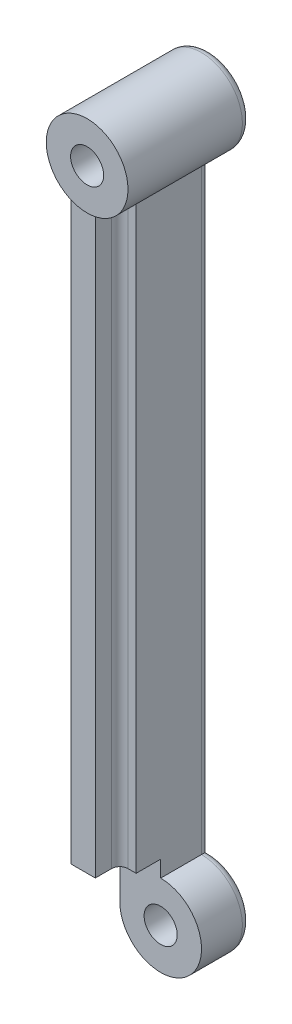
ISO-10303-21;
HEADER;
FILE_DESCRIPTION(('STEP AP214'),'2;1');
FILE_NAME('part.step','',(''),(''),'','','');
FILE_SCHEMA(('AUTOMOTIVE_DESIGN { 1 0 10303 214 1 1 1 1 }'));
ENDSEC;
DATA;
#1=APPLICATION_CONTEXT('core data for automotive mechanical design processes');
#2=APPLICATION_PROTOCOL_DEFINITION('international standard','automotive_design',2000,#1);
#3=PRODUCT_CONTEXT('',#1,'mechanical');
#4=PRODUCT('Part','Part','',(#3));
#5=PRODUCT_RELATED_PRODUCT_CATEGORY('part','',(#4));
#6=PRODUCT_DEFINITION_FORMATION('','',#4);
#7=PRODUCT_DEFINITION_CONTEXT('part definition',#1,'design');
#8=PRODUCT_DEFINITION('design','',#6,#7);
#9=PRODUCT_DEFINITION_SHAPE('','',#8);
#10=(LENGTH_UNIT() NAMED_UNIT(*) SI_UNIT(.MILLI.,.METRE.));
#11=(NAMED_UNIT(*) PLANE_ANGLE_UNIT() SI_UNIT($,.RADIAN.));
#12=(NAMED_UNIT(*) SI_UNIT($,.STERADIAN.) SOLID_ANGLE_UNIT());
#13=UNCERTAINTY_MEASURE_WITH_UNIT(LENGTH_MEASURE(1.E-05),#10,'distance_accuracy_value','');
#14=(GEOMETRIC_REPRESENTATION_CONTEXT(3) GLOBAL_UNCERTAINTY_ASSIGNED_CONTEXT((#13)) GLOBAL_UNIT_ASSIGNED_CONTEXT((#10,
#11,#12)) REPRESENTATION_CONTEXT('',''));
#15=CARTESIAN_POINT('',(0.,0.,0.));
#16=DIRECTION('',(0.,0.,1.));
#17=DIRECTION('',(1.,0.,0.));
#18=AXIS2_PLACEMENT_3D('',#15,#16,#17);
#19=CARTESIAN_POINT('',(0.,0.,9.));
#20=DIRECTION('',(0.,0.,1.));
#21=DIRECTION('',(1.,0.,0.));
#22=AXIS2_PLACEMENT_3D('',#19,#20,#21);
#23=PLANE('',#22);
#24=CARTESIAN_POINT('',(0.,85.,9.));
#25=DIRECTION('',(0.,0.,1.));
#26=DIRECTION('',(1.,0.,0.));
#27=AXIS2_PLACEMENT_3D('',#24,#25,#26);
#28=CIRCLE('',#27,5.);
#29=CARTESIAN_POINT('',(-1.,80.1010205144336,9.));
#30=VERTEX_POINT('',#29);
#31=CARTESIAN_POINT('',(0.,80.,9.));
#32=VERTEX_POINT('',#31);
#33=EDGE_CURVE('E154',#30,#32,#28,.T.);
#34=ORIENTED_EDGE('',*,*,#33,.F.);
#35=DIRECTION('',(0.,1.,0.));
#36=VECTOR('',#35,1.);
#37=CARTESIAN_POINT('',(-0.999999999999995,0.,9.));
#38=LINE('',#37,#36);
#39=CARTESIAN_POINT('',(-0.999999999999996,7.01125174005379,9.));
#40=VERTEX_POINT('',#39);
#41=EDGE_CURVE('E43',#30,#40,#38,.F.);
#42=ORIENTED_EDGE('',*,*,#41,.T.);
#43=DIRECTION('',(-1.,0.,0.));
#44=VECTOR('',#43,1.);
#45=CARTESIAN_POINT('',(0.,7.01125174005379,9.));
#46=LINE('',#45,#44);
#47=CARTESIAN_POINT('',(0.,7.01125174005379,9.));
#48=VERTEX_POINT('',#47);
#49=EDGE_CURVE('E288',#48,#40,#46,.T.);
#50=ORIENTED_EDGE('',*,*,#49,.F.);
#51=DIRECTION('',(0.,1.,0.));
#52=VECTOR('',#51,1.);
#53=CARTESIAN_POINT('',(0.,5.,9.));
#54=LINE('',#53,#52);
#55=EDGE_CURVE('E165',#48,#32,#54,.T.);
#56=ORIENTED_EDGE('',*,*,#55,.T.);
#57=EDGE_LOOP('',(#34,#42,#50,#56));
#58=FACE_BOUND('',#57,.T.);
#59=ADVANCED_FACE('F34',(#58),#23,.T.);
#60=CARTESIAN_POINT('',(0.,85.,9.));
#61=DIRECTION('',(0.,0.,-1.));
#62=DIRECTION('',(-1.,0.,0.));
#63=AXIS2_PLACEMENT_3D('',#60,#61,#62);
#64=CYLINDRICAL_SURFACE('',#63,5.00000000000001);
#65=CARTESIAN_POINT('',(0.,85.,15.));
#66=DIRECTION('',(0.,0.,1.));
#67=DIRECTION('',(1.,0.,0.));
#68=AXIS2_PLACEMENT_3D('',#65,#66,#67);
#69=CIRCLE('',#68,5.);
#70=CARTESIAN_POINT('',(5.,85.,15.));
#71=VERTEX_POINT('',#70);
#72=EDGE_CURVE('E155',#71,#71,#69,.T.);
#73=ORIENTED_EDGE('',*,*,#72,.F.);
#74=EDGE_LOOP('',(#73));
#75=FACE_BOUND('',#74,.T.);
#76=DIRECTION('',(0.,0.,-1.));
#77=VECTOR('',#76,1.);
#78=CARTESIAN_POINT('',(-2.,80.4174243050442,12.));
#79=LINE('',#78,#77);
#80=CARTESIAN_POINT('',(-2.,80.4174243050442,12.));
#81=VERTEX_POINT('',#80);
#82=CARTESIAN_POINT('',(-2.,80.4174243050442,10.));
#83=VERTEX_POINT('',#82);
#84=EDGE_CURVE('E144',#81,#83,#79,.T.);
#85=ORIENTED_EDGE('',*,*,#84,.T.);
#86=CARTESIAN_POINT('',(-2.,80.4174243050442,10.));
#87=CARTESIAN_POINT('',(-2.00000105898368,80.4174262276151,9.97330925859388));
#88=CARTESIAN_POINT('',(-1.99893067820831,80.4169574695901,9.94663228494766));
#89=CARTESIAN_POINT('',(-1.99466873623861,80.4151003556573,9.89348846480926));
#90=CARTESIAN_POINT('',(-1.99147781365518,80.4137122766078,9.86702155748223));
#91=CARTESIAN_POINT('',(-1.97879338685613,80.4082175384006,9.78841849731535));
#92=CARTESIAN_POINT('',(-1.96618777165364,80.4027799767901,9.73684034355798));
#93=CARTESIAN_POINT('',(-1.93319080474755,80.3888082858261,9.63677238261292));
#94=CARTESIAN_POINT('',(-1.91280493282475,80.3802763361181,9.58828042973909));
#95=CARTESIAN_POINT('',(-1.86495265907223,80.3607524697316,9.49543470981768));
#96=CARTESIAN_POINT('',(-1.8374811925309,80.3497587941805,9.45108393385467));
#97=CARTESIAN_POINT('',(-1.77491309193018,80.3255101435136,9.36561981488251));
#98=CARTESIAN_POINT('',(-1.73953231413985,80.3121765030245,9.32473728904799));
#99=CARTESIAN_POINT('',(-1.6628792542394,80.2844413647406,9.24934483317053));
#100=CARTESIAN_POINT('',(-1.6216046529362,80.2700394476609,9.21483742402636));
#101=CARTESIAN_POINT('',(-1.53114650537546,80.2399568916855,9.15078867626431));
#102=CARTESIAN_POINT('',(-1.48161556425956,80.2242560255882,9.12174645328768));
#103=CARTESIAN_POINT('',(-1.37820071022287,80.1933929640703,9.07250827741418));
#104=CARTESIAN_POINT('',(-1.3243191124048,80.1782304882622,9.05230765592955));
#105=CARTESIAN_POINT('',(-1.22546021527541,80.1522928665702,9.02470136000962));
#106=CARTESIAN_POINT('',(-1.18104590766897,80.1412733539145,9.01548239632729));
#107=CARTESIAN_POINT('',(-1.09114402142545,80.1202897633798,9.00312601090762));
#108=CARTESIAN_POINT('',(-1.04565657397635,80.110325557302,8.9999878496706));
#109=CARTESIAN_POINT('',(-1.00000000000001,80.1010205144336,9.));
#110=B_SPLINE_CURVE_WITH_KNOTS('',3,(#86,#87,#88,#89,#90,#91,#92,#93,#94,#95,#96,#97,#98,#99,
#100,#101,#102,#103,#104,#105,#106,#107,#108,#109),.UNSPECIFIED.,.F.,.F.,(4,2,2,2,2,2,2,2,2,2,2,
4),(0.,0.0800198389240395,0.160015590420398,0.31929780475126,0.478468040047297,
0.637752365454774,0.804101005866625,0.970515285028636,1.14827776879244,1.32594627592812,
1.46558180408251,1.60520034978918),.UNSPECIFIED.);
#111=EDGE_CURVE('E57',#83,#30,#110,.T.);
#112=ORIENTED_EDGE('',*,*,#111,.T.);
#113=ORIENTED_EDGE('',*,*,#33,.T.);
#114=DIRECTION('',(0.,0.,-1.));
#115=VECTOR('',#114,1.);
#116=CARTESIAN_POINT('',(0.,80.,9.));
#117=LINE('',#116,#115);
#118=CARTESIAN_POINT('',(0.,80.,0.999999999999999));
#119=VERTEX_POINT('',#118);
#120=EDGE_CURVE('E173',#32,#119,#117,.T.);
#121=ORIENTED_EDGE('',*,*,#120,.T.);
#122=CARTESIAN_POINT('',(0.,85.,0.999999999999999));
#123=DIRECTION('',(0.,0.,1.));
#124=DIRECTION('',(1.,0.,0.));
#125=AXIS2_PLACEMENT_3D('',#122,#123,#124);
#126=CIRCLE('',#125,5.00000000000001);
#127=CARTESIAN_POINT('',(-5.,85.,0.999999999999999));
#128=VERTEX_POINT('',#127);
#129=EDGE_CURVE('E197',#119,#128,#126,.T.);
#130=ORIENTED_EDGE('',*,*,#129,.T.);
#131=DIRECTION('',(0.,0.,-1.));
#132=VECTOR('',#131,1.);
#133=CARTESIAN_POINT('',(-5.,85.,9.));
#134=LINE('',#133,#132);
#135=CARTESIAN_POINT('',(-5.00000000000001,85.,12.));
#136=VERTEX_POINT('',#135);
#137=EDGE_CURVE('E171',#136,#128,#134,.T.);
#138=ORIENTED_EDGE('',*,*,#137,.F.);
#139=CARTESIAN_POINT('',(0.,85.,12.));
#140=DIRECTION('',(0.,0.,-1.));
#141=DIRECTION('',(1.,0.,0.));
#142=AXIS2_PLACEMENT_3D('',#139,#140,#141);
#143=CIRCLE('',#142,5.00000000000001);
#144=EDGE_CURVE('E143',#81,#136,#143,.T.);
#145=ORIENTED_EDGE('',*,*,#144,.F.);
#146=EDGE_LOOP('',(#85,#112,#113,#121,#130,#138,#145));
#147=FACE_BOUND('',#146,.T.);
#148=ADVANCED_FACE('F240',(#75,#147),#64,.T.);
#149=CARTESIAN_POINT('',(0.,0.,0.));
#150=DIRECTION('',(0.,0.,1.));
#151=DIRECTION('',(1.,0.,0.));
#152=AXIS2_PLACEMENT_3D('',#149,#150,#151);
#153=PLANE('',#152);
#154=CARTESIAN_POINT('',(0.,85.,0.));
#155=DIRECTION('',(0.,0.,1.));
#156=DIRECTION('',(1.,0.,0.));
#157=AXIS2_PLACEMENT_3D('',#154,#155,#156);
#158=CIRCLE('',#157,4.00000000000001);
#159=CARTESIAN_POINT('',(-4.,85.,0.));
#160=VERTEX_POINT('',#159);
#161=CARTESIAN_POINT('',(-1.,81.1270166537926,0.));
#162=VERTEX_POINT('',#161);
#163=EDGE_CURVE('E192',#160,#162,#158,.F.);
#164=ORIENTED_EDGE('',*,*,#163,.T.);
#165=DIRECTION('',(0.,1.,0.));
#166=VECTOR('',#165,1.);
#167=CARTESIAN_POINT('',(-1.,0.,0.));
#168=LINE('',#167,#166);
#169=CARTESIAN_POINT('',(-1.,3.87298334620742,0.));
#170=VERTEX_POINT('',#169);
#171=EDGE_CURVE('E194',#162,#170,#168,.F.);
#172=ORIENTED_EDGE('',*,*,#171,.T.);
#173=CARTESIAN_POINT('',(0.,0.,0.));
#174=DIRECTION('',(0.,0.,1.));
#175=DIRECTION('',(1.,0.,0.));
#176=AXIS2_PLACEMENT_3D('',#173,#174,#175);
#177=CIRCLE('',#176,4.);
#178=CARTESIAN_POINT('',(-4.,0.,0.));
#179=VERTEX_POINT('',#178);
#180=EDGE_CURVE('E190',#170,#179,#177,.F.);
#181=ORIENTED_EDGE('',*,*,#180,.T.);
#182=DIRECTION('',(0.,-1.,0.));
#183=VECTOR('',#182,1.);
#184=CARTESIAN_POINT('',(-4.,0.,0.));
#185=LINE('',#184,#183);
#186=EDGE_CURVE('E188',#179,#160,#185,.F.);
#187=ORIENTED_EDGE('',*,*,#186,.T.);
#188=EDGE_LOOP('',(#164,#172,#181,#187));
#189=FACE_BOUND('',#188,.T.);
#190=CARTESIAN_POINT('',(0.,85.,0.));
#191=DIRECTION('',(0.,0.,1.));
#192=DIRECTION('',(1.,0.,0.));
#193=AXIS2_PLACEMENT_3D('',#190,#191,#192);
#194=CIRCLE('',#193,2.025);
#195=CARTESIAN_POINT('',(2.025,85.,0.));
#196=VERTEX_POINT('',#195);
#197=EDGE_CURVE('E162',#196,#196,#194,.T.);
#198=ORIENTED_EDGE('',*,*,#197,.T.);
#199=EDGE_LOOP('',(#198));
#200=FACE_BOUND('',#199,.T.);
#201=CARTESIAN_POINT('',(0.,0.,0.));
#202=DIRECTION('',(0.,0.,1.));
#203=DIRECTION('',(1.,0.,0.));
#204=AXIS2_PLACEMENT_3D('',#201,#202,#203);
#205=CIRCLE('',#204,2.025);
#206=CARTESIAN_POINT('',(2.025,0.,0.));
#207=VERTEX_POINT('',#206);
#208=EDGE_CURVE('E158',#207,#207,#205,.T.);
#209=ORIENTED_EDGE('',*,*,#208,.T.);
#210=EDGE_LOOP('',(#209));
#211=FACE_BOUND('',#210,.T.);
#212=ADVANCED_FACE('F245',(#189,#200,#211),#153,.F.);
#213=CARTESIAN_POINT('',(0.,0.,9.));
#214=DIRECTION('',(0.,0.,-1.));
#215=DIRECTION('',(-1.,0.,0.));
#216=AXIS2_PLACEMENT_3D('',#213,#214,#215);
#217=CYLINDRICAL_SURFACE('',#216,5.);
#218=DIRECTION('',(0.,0.,-1.));
#219=VECTOR('',#218,1.);
#220=CARTESIAN_POINT('',(-5.,0.,9.));
#221=LINE('',#220,#219);
#222=CARTESIAN_POINT('',(-5.,0.,6.));
#223=VERTEX_POINT('',#222);
#224=CARTESIAN_POINT('',(-5.,0.,0.999999999999999));
#225=VERTEX_POINT('',#224);
#226=EDGE_CURVE('E168',#223,#225,#221,.T.);
#227=ORIENTED_EDGE('',*,*,#226,.T.);
#228=CARTESIAN_POINT('',(0.,0.,0.999999999999999));
#229=DIRECTION('',(0.,0.,1.));
#230=DIRECTION('',(1.,0.,0.));
#231=AXIS2_PLACEMENT_3D('',#228,#229,#230);
#232=CIRCLE('',#231,5.);
#233=CARTESIAN_POINT('',(0.,5.,0.999999999999999));
#234=VERTEX_POINT('',#233);
#235=EDGE_CURVE('E199',#225,#234,#232,.T.);
#236=ORIENTED_EDGE('',*,*,#235,.T.);
#237=DIRECTION('',(0.,0.,-1.));
#238=VECTOR('',#237,1.);
#239=CARTESIAN_POINT('',(0.,5.,9.));
#240=LINE('',#239,#238);
#241=CARTESIAN_POINT('',(0.,5.,6.));
#242=VERTEX_POINT('',#241);
#243=EDGE_CURVE('E176',#242,#234,#240,.T.);
#244=ORIENTED_EDGE('',*,*,#243,.F.);
#245=CARTESIAN_POINT('',(0.,0.,6.));
#246=DIRECTION('',(0.,0.,-1.));
#247=DIRECTION('',(0.,1.,0.));
#248=AXIS2_PLACEMENT_3D('',#245,#246,#247);
#249=CIRCLE('',#248,5.);
#250=EDGE_CURVE('E294',#242,#223,#249,.T.);
#251=ORIENTED_EDGE('',*,*,#250,.T.);
#252=EDGE_LOOP('',(#227,#236,#244,#251));
#253=FACE_BOUND('',#252,.T.);
#254=ADVANCED_FACE('F254',(#253),#217,.T.);
#255=CARTESIAN_POINT('',(0.,5.,9.));
#256=DIRECTION('',(-1.,0.,0.));
#257=DIRECTION('',(0.,0.,1.));
#258=AXIS2_PLACEMENT_3D('',#255,#256,#257);
#259=PLANE('',#258);
#260=ORIENTED_EDGE('',*,*,#243,.T.);
#261=DIRECTION('',(0.,1.,0.));
#262=VECTOR('',#261,1.);
#263=CARTESIAN_POINT('',(0.,5.,0.999999999999999));
#264=LINE('',#263,#262);
#265=EDGE_CURVE('E180',#234,#119,#264,.T.);
#266=ORIENTED_EDGE('',*,*,#265,.T.);
#267=ORIENTED_EDGE('',*,*,#120,.F.);
#268=ORIENTED_EDGE('',*,*,#55,.F.);
#269=DIRECTION('',(0.,0.,-1.));
#270=VECTOR('',#269,1.);
#271=CARTESIAN_POINT('',(0.,7.01125174005379,9.));
#272=LINE('',#271,#270);
#273=CARTESIAN_POINT('',(0.,7.01125174005379,6.));
#274=VERTEX_POINT('',#273);
#275=EDGE_CURVE('E185',#48,#274,#272,.T.);
#276=ORIENTED_EDGE('',*,*,#275,.T.);
#277=DIRECTION('',(0.,-1.,0.));
#278=VECTOR('',#277,1.);
#279=CARTESIAN_POINT('',(0.,5.,6.));
#280=LINE('',#279,#278);
#281=EDGE_CURVE('E184',#274,#242,#280,.T.);
#282=ORIENTED_EDGE('',*,*,#281,.T.);
#283=EDGE_LOOP('',(#260,#266,#267,#268,#276,#282));
#284=FACE_BOUND('',#283,.T.);
#285=ADVANCED_FACE('F257',(#284),#259,.F.);
#286=CARTESIAN_POINT('',(-5.,0.,9.));
#287=DIRECTION('',(1.,0.,0.));
#288=DIRECTION('',(0.,1.,0.));
#289=AXIS2_PLACEMENT_3D('',#286,#287,#288);
#290=PLANE('',#289);
#291=ORIENTED_EDGE('',*,*,#137,.T.);
#292=DIRECTION('',(0.,-1.,0.));
#293=VECTOR('',#292,1.);
#294=CARTESIAN_POINT('',(-5.,0.,0.999999999999999));
#295=LINE('',#294,#293);
#296=EDGE_CURVE('E201',#128,#225,#295,.T.);
#297=ORIENTED_EDGE('',*,*,#296,.T.);
#298=ORIENTED_EDGE('',*,*,#226,.F.);
#299=DIRECTION('',(0.,-1.,0.));
#300=VECTOR('',#299,1.);
#301=CARTESIAN_POINT('',(-5.,7.01125174005379,6.));
#302=LINE('',#301,#300);
#303=CARTESIAN_POINT('',(-5.,7.01125174005379,6.));
#304=VERTEX_POINT('',#303);
#305=EDGE_CURVE('E129',#304,#223,#302,.T.);
#306=ORIENTED_EDGE('',*,*,#305,.F.);
#307=DIRECTION('',(0.,0.,-1.));
#308=VECTOR('',#307,1.);
#309=CARTESIAN_POINT('',(-5.,7.01125174005379,12.));
#310=LINE('',#309,#308);
#311=CARTESIAN_POINT('',(-5.,7.01125174005379,12.));
#312=VERTEX_POINT('',#311);
#313=EDGE_CURVE('E121',#312,#304,#310,.T.);
#314=ORIENTED_EDGE('',*,*,#313,.F.);
#315=DIRECTION('',(0.,-1.,0.));
#316=VECTOR('',#315,1.);
#317=CARTESIAN_POINT('',(-5.,0.,12.));
#318=LINE('',#317,#316);
#319=EDGE_CURVE('E135',#136,#312,#318,.T.);
#320=ORIENTED_EDGE('',*,*,#319,.F.);
#321=EDGE_LOOP('',(#291,#297,#298,#306,#314,#320));
#322=FACE_BOUND('',#321,.T.);
#323=ADVANCED_FACE('F134',(#322),#290,.F.);
#324=CARTESIAN_POINT('',(0.,85.,9.));
#325=DIRECTION('',(0.,0.,-1.));
#326=DIRECTION('',(-1.,0.,0.));
#327=AXIS2_PLACEMENT_3D('',#324,#325,#326);
#328=CYLINDRICAL_SURFACE('',#327,2.025);
#329=ORIENTED_EDGE('',*,*,#197,.F.);
#330=EDGE_LOOP('',(#329));
#331=FACE_BOUND('',#330,.T.);
#332=CARTESIAN_POINT('',(0.,85.,15.));
#333=DIRECTION('',(0.,0.,1.));
#334=DIRECTION('',(1.,0.,0.));
#335=AXIS2_PLACEMENT_3D('',#332,#333,#334);
#336=CIRCLE('',#335,2.025);
#337=CARTESIAN_POINT('',(2.025,85.,15.));
#338=VERTEX_POINT('',#337);
#339=EDGE_CURVE('E146',#338,#338,#336,.T.);
#340=ORIENTED_EDGE('',*,*,#339,.T.);
#341=EDGE_LOOP('',(#340));
#342=FACE_BOUND('',#341,.T.);
#343=ADVANCED_FACE('F250',(#331,#342),#328,.F.);
#344=CARTESIAN_POINT('',(0.,0.,9.));
#345=DIRECTION('',(0.,0.,-1.));
#346=DIRECTION('',(-1.,0.,0.));
#347=AXIS2_PLACEMENT_3D('',#344,#345,#346);
#348=CYLINDRICAL_SURFACE('',#347,2.025);
#349=CARTESIAN_POINT('',(0.,0.,6.));
#350=DIRECTION('',(0.,0.,-1.));
#351=DIRECTION('',(0.,1.,0.));
#352=AXIS2_PLACEMENT_3D('',#349,#350,#351);
#353=CIRCLE('',#352,2.025);
#354=CARTESIAN_POINT('',(0.,2.025,6.));
#355=VERTEX_POINT('',#354);
#356=EDGE_CURVE('E181',#355,#355,#353,.T.);
#357=ORIENTED_EDGE('',*,*,#356,.F.);
#358=EDGE_LOOP('',(#357));
#359=FACE_BOUND('',#358,.T.);
#360=ORIENTED_EDGE('',*,*,#208,.F.);
#361=EDGE_LOOP('',(#360));
#362=FACE_BOUND('',#361,.T.);
#363=ADVANCED_FACE('F380',(#359,#362),#348,.F.);
#364=CARTESIAN_POINT('',(0.,85.,15.));
#365=DIRECTION('',(0.,0.,1.));
#366=DIRECTION('',(1.,0.,0.));
#367=AXIS2_PLACEMENT_3D('',#364,#365,#366);
#368=PLANE('',#367);
#369=ORIENTED_EDGE('',*,*,#72,.T.);
#370=EDGE_LOOP('',(#369));
#371=FACE_BOUND('',#370,.T.);
#372=ORIENTED_EDGE('',*,*,#339,.F.);
#373=EDGE_LOOP('',(#372));
#374=FACE_BOUND('',#373,.T.);
#375=ADVANCED_FACE('F374',(#371,#374),#368,.T.);
#376=CARTESIAN_POINT('',(0.,0.,12.));
#377=DIRECTION('',(0.,0.,-1.));
#378=DIRECTION('',(-1.,0.,0.));
#379=AXIS2_PLACEMENT_3D('',#376,#377,#378);
#380=PLANE('',#379);
#381=ORIENTED_EDGE('',*,*,#319,.T.);
#382=DIRECTION('',(-1.,0.,0.));
#383=VECTOR('',#382,1.);
#384=CARTESIAN_POINT('',(5.,7.01125174005379,12.));
#385=LINE('',#384,#383);
#386=CARTESIAN_POINT('',(-2.,7.01125174005379,12.));
#387=VERTEX_POINT('',#386);
#388=EDGE_CURVE('E117',#387,#312,#385,.T.);
#389=ORIENTED_EDGE('',*,*,#388,.F.);
#390=DIRECTION('',(0.,1.,0.));
#391=VECTOR('',#390,1.);
#392=CARTESIAN_POINT('',(-2.,80.4174243050442,12.));
#393=LINE('',#392,#391);
#394=EDGE_CURVE('E148',#387,#81,#393,.T.);
#395=ORIENTED_EDGE('',*,*,#394,.T.);
#396=ORIENTED_EDGE('',*,*,#144,.T.);
#397=EDGE_LOOP('',(#381,#389,#395,#396));
#398=FACE_BOUND('',#397,.T.);
#399=ADVANCED_FACE('F141',(#398),#380,.F.);
#400=CARTESIAN_POINT('',(-2.,80.4174243050442,12.));
#401=DIRECTION('',(-1.,0.,0.));
#402=DIRECTION('',(0.,-1.,0.));
#403=AXIS2_PLACEMENT_3D('',#400,#401,#402);
#404=PLANE('',#403);
#405=DIRECTION('',(0.,0.,-1.));
#406=VECTOR('',#405,1.);
#407=CARTESIAN_POINT('',(-2.,7.01125174005379,12.));
#408=LINE('',#407,#406);
#409=CARTESIAN_POINT('',(-2.,7.01125174005379,10.));
#410=VERTEX_POINT('',#409);
#411=EDGE_CURVE('E124',#387,#410,#408,.T.);
#412=ORIENTED_EDGE('',*,*,#411,.T.);
#413=DIRECTION('',(0.,1.,0.));
#414=VECTOR('',#413,1.);
#415=CARTESIAN_POINT('',(-2.,80.4174243050442,10.));
#416=LINE('',#415,#414);
#417=EDGE_CURVE('E203',#410,#83,#416,.T.);
#418=ORIENTED_EDGE('',*,*,#417,.T.);
#419=ORIENTED_EDGE('',*,*,#84,.F.);
#420=ORIENTED_EDGE('',*,*,#394,.F.);
#421=EDGE_LOOP('',(#412,#418,#419,#420));
#422=FACE_BOUND('',#421,.T.);
#423=ADVANCED_FACE('F297',(#422),#404,.F.);
#424=CARTESIAN_POINT('',(5.,7.01125174005379,6.));
#425=DIRECTION('',(0.,0.,-1.));
#426=DIRECTION('',(0.,1.,0.));
#427=AXIS2_PLACEMENT_3D('',#424,#425,#426);
#428=PLANE('',#427);
#429=ORIENTED_EDGE('',*,*,#356,.T.);
#430=EDGE_LOOP('',(#429));
#431=FACE_BOUND('',#430,.T.);
#432=ORIENTED_EDGE('',*,*,#250,.F.);
#433=ORIENTED_EDGE('',*,*,#281,.F.);
#434=DIRECTION('',(-1.,0.,0.));
#435=VECTOR('',#434,1.);
#436=CARTESIAN_POINT('',(5.,7.01125174005379,6.));
#437=LINE('',#436,#435);
#438=EDGE_CURVE('E128',#274,#304,#437,.T.);
#439=ORIENTED_EDGE('',*,*,#438,.T.);
#440=ORIENTED_EDGE('',*,*,#305,.T.);
#441=EDGE_LOOP('',(#432,#433,#439,#440));
#442=FACE_BOUND('',#441,.T.);
#443=ADVANCED_FACE('F236',(#431,#442),#428,.F.);
#444=CARTESIAN_POINT('',(5.,7.01125174005379,12.));
#445=DIRECTION('',(0.,1.,0.));
#446=DIRECTION('',(0.,0.,1.));
#447=AXIS2_PLACEMENT_3D('',#444,#445,#446);
#448=PLANE('',#447);
#449=ORIENTED_EDGE('',*,*,#49,.T.);
#450=CARTESIAN_POINT('',(-0.999999999999996,7.01125174005379,10.));
#451=DIRECTION('',(0.,1.,0.));
#452=DIRECTION('',(0.,0.,1.));
#453=AXIS2_PLACEMENT_3D('',#450,#451,#452);
#454=CIRCLE('',#453,1.);
#455=EDGE_CURVE('E11',#40,#410,#454,.T.);
#456=ORIENTED_EDGE('',*,*,#455,.T.);
#457=ORIENTED_EDGE('',*,*,#411,.F.);
#458=ORIENTED_EDGE('',*,*,#388,.T.);
#459=ORIENTED_EDGE('',*,*,#313,.T.);
#460=ORIENTED_EDGE('',*,*,#438,.F.);
#461=ORIENTED_EDGE('',*,*,#275,.F.);
#462=EDGE_LOOP('',(#449,#456,#457,#458,#459,#460,#461));
#463=FACE_BOUND('',#462,.T.);
#464=ADVANCED_FACE('F119',(#463),#448,.F.);
#465=CARTESIAN_POINT('',(-4.,0.,0.999999999999999));
#466=DIRECTION('',(0.,-1.,0.));
#467=DIRECTION('',(1.,0.,0.));
#468=AXIS2_PLACEMENT_3D('',#465,#466,#467);
#469=CYLINDRICAL_SURFACE('',#468,1.);
#470=CARTESIAN_POINT('',(-4.,85.,1.));
#471=DIRECTION('',(0.,1.,0.));
#472=DIRECTION('',(0.,0.,1.));
#473=AXIS2_PLACEMENT_3D('',#470,#471,#472);
#474=CIRCLE('',#473,1.);
#475=EDGE_CURVE('E269',#160,#128,#474,.T.);
#476=ORIENTED_EDGE('',*,*,#475,.F.);
#477=ORIENTED_EDGE('',*,*,#186,.F.);
#478=CARTESIAN_POINT('',(-4.,0.,0.999999999999999));
#479=DIRECTION('',(0.,-1.,0.));
#480=DIRECTION('',(0.,0.,-1.));
#481=AXIS2_PLACEMENT_3D('',#478,#479,#480);
#482=CIRCLE('',#481,1.);
#483=EDGE_CURVE('E138',#225,#179,#482,.T.);
#484=ORIENTED_EDGE('',*,*,#483,.F.);
#485=ORIENTED_EDGE('',*,*,#296,.F.);
#486=EDGE_LOOP('',(#476,#477,#484,#485));
#487=FACE_BOUND('',#486,.T.);
#488=ADVANCED_FACE('F229',(#487),#469,.T.);
#489=CARTESIAN_POINT('',(0.,0.,0.999999999999999));
#490=DIRECTION('',(0.,0.,1.));
#491=DIRECTION('',(1.,0.,0.));
#492=AXIS2_PLACEMENT_3D('',#489,#490,#491);
#493=TOROIDAL_SURFACE('',#492,4.,1.);
#494=ORIENTED_EDGE('',*,*,#483,.T.);
#495=ORIENTED_EDGE('',*,*,#180,.F.);
#496=CARTESIAN_POINT('',(0.,5.,0.999999999999999));
#497=CARTESIAN_POINT('',(2.87946317523921E-06,5.00000233218833,0.977768441770725));
#498=CARTESIAN_POINT('',(-0.000742033287419084,4.99925801501361,0.955550301977645));
#499=CARTESIAN_POINT('',(-0.00369346748860575,4.99630550022832,0.911324453424134));
#500=CARTESIAN_POINT('',(-0.0058989679397359,4.99409832520328,0.889316608554415));
#501=CARTESIAN_POINT('',(-0.0146053705874565,4.98537676299928,0.824223229055431));
#502=CARTESIAN_POINT('',(-0.0231975293310298,4.97676113375247,0.781668677507043));
#503=CARTESIAN_POINT('',(-0.0452936501496936,4.95451151498729,0.699415474621846));
#504=CARTESIAN_POINT('',(-0.0587858258776961,4.94088956657933,0.659710241799498));
#505=CARTESIAN_POINT('',(-0.089848950588142,4.90935431224459,0.583687602560609));
#506=CARTESIAN_POINT('',(-0.10742824682033,4.89143222157751,0.547377345530083));
#507=CARTESIAN_POINT('',(-0.1531115480888,4.84454525595928,0.465453069064713));
#508=CARTESIAN_POINT('',(-0.182672530345869,4.81397567850018,0.421572230136797));
#509=CARTESIAN_POINT('',(-0.245923935306736,4.74782701353902,0.341216807318825));
#510=CARTESIAN_POINT('',(-0.27962163221845,4.7122390846968,0.304755578417582));
#511=CARTESIAN_POINT('',(-0.364280354310522,4.62168806363391,0.225073081431244));
#512=CARTESIAN_POINT('',(-0.416565646737399,4.56484803114034,0.185405479052967));
#513=CARTESIAN_POINT('',(-0.523439767685423,4.44625022487487,0.118595845568447));
#514=CARTESIAN_POINT('',(-0.57803250451706,4.38448393622692,0.0914760782457421));
#515=CARTESIAN_POINT('',(-0.693950501653138,4.25035205006902,0.0457203671807838));
#516=CARTESIAN_POINT('',(-0.755327216979815,4.17758488487012,0.0284207327160351));
#517=CARTESIAN_POINT('',(-0.87687021222265,4.0294883721752,0.00568982812318799));
#518=CARTESIAN_POINT('',(-0.937038249148087,3.95416324838243,0.000239875403654188));
#519=CARTESIAN_POINT('',(-0.997375506825806,3.8763704463533,2.58834553618662E-06));
#520=CARTESIAN_POINT('',(-0.998688039716485,3.87467708490144,6.75904469721858E-09));
#521=CARTESIAN_POINT('',(-1.,3.87298334620742,0.));
#522=B_SPLINE_CURVE_WITH_KNOTS('',3,(#496,#497,#498,#499,#500,#501,#502,#503,#504,#505,#506,
#507,#508,#509,#510,#511,#512,#513,#514,#515,#516,#517,#518,#519,#520,#521),.UNSPECIFIED.,.F.,
.F.,(4,2,2,2,2,2,2,2,2,2,2,2,4),(0.,0.0666442384215332,0.133241939405098,0.26525836891142,
0.396959330918163,0.528931669980172,0.71123631536925,0.893866254249698,1.15290252975534,
1.41239667053992,1.70176807027958,1.99068290587953,1.99711033823818),.UNSPECIFIED.);
#523=EDGE_CURVE('E212',#234,#170,#522,.T.);
#524=ORIENTED_EDGE('',*,*,#523,.F.);
#525=ORIENTED_EDGE('',*,*,#235,.F.);
#526=EDGE_LOOP('',(#494,#495,#524,#525));
#527=FACE_BOUND('',#526,.T.);
#528=ADVANCED_FACE('F225',(#527),#493,.T.);
#529=CARTESIAN_POINT('',(0.,85.,0.999999999999999));
#530=DIRECTION('',(0.,0.,1.));
#531=DIRECTION('',(1.,0.,0.));
#532=AXIS2_PLACEMENT_3D('',#529,#530,#531);
#533=TOROIDAL_SURFACE('',#532,4.00000000000001,1.);
#534=ORIENTED_EDGE('',*,*,#475,.T.);
#535=ORIENTED_EDGE('',*,*,#129,.F.);
#536=CARTESIAN_POINT('',(0.,80.,0.999999999999999));
#537=CARTESIAN_POINT('',(2.87946317498347E-06,79.9999976678117,0.977768441770724));
#538=CARTESIAN_POINT('',(-0.000742033287419189,80.0007419849864,0.955550301977644));
#539=CARTESIAN_POINT('',(-0.00369346748860562,80.0036944997717,0.911324453424133));
#540=CARTESIAN_POINT('',(-0.00589896793973564,80.0059016747967,0.889316608554416));
#541=CARTESIAN_POINT('',(-0.014605370587456,80.0146232370007,0.824223229055432));
#542=CARTESIAN_POINT('',(-0.0231975293310294,80.0232388662475,0.781668677507044));
#543=CARTESIAN_POINT('',(-0.0452936501496939,80.0454884850127,0.699415474621845));
#544=CARTESIAN_POINT('',(-0.0587858258776971,80.0591104334207,0.659710241799496));
#545=CARTESIAN_POINT('',(-0.089848950588143,80.0906456877554,0.583687602560607));
#546=CARTESIAN_POINT('',(-0.10742824682033,80.1085677784225,0.547377345530083));
#547=CARTESIAN_POINT('',(-0.1531115480888,80.1554547440407,0.465453069064713));
#548=CARTESIAN_POINT('',(-0.182672530345869,80.1860243214998,0.421572230136797));
#549=CARTESIAN_POINT('',(-0.245923935306735,80.252172986461,0.341216807318825));
#550=CARTESIAN_POINT('',(-0.279621632218448,80.2877609153032,0.304755578417584));
#551=CARTESIAN_POINT('',(-0.364280354310522,80.3783119363661,0.225073081431243));
#552=CARTESIAN_POINT('',(-0.416565646737406,80.4351519688597,0.185405479052964));
#553=CARTESIAN_POINT('',(-0.523439767685426,80.5537497751251,0.118595845568444));
#554=CARTESIAN_POINT('',(-0.578032504517055,80.6155160637731,0.0914760782457413));
#555=CARTESIAN_POINT('',(-0.693950501653144,80.749647949931,0.0457203671807847));
#556=CARTESIAN_POINT('',(-0.755327216979842,80.8224151151299,0.0284207327160352));
#557=CARTESIAN_POINT('',(-0.87687021222263,80.9705116278248,0.00568982812318644));
#558=CARTESIAN_POINT('',(-0.937038249147998,81.0458367516177,0.000239875403652776));
#559=CARTESIAN_POINT('',(-0.997375506825808,81.1236295536467,2.58834553613839E-06));
#560=CARTESIAN_POINT('',(-0.998688039716486,81.1253229150986,6.75904467895236E-09));
#561=CARTESIAN_POINT('',(-1.,81.1270166537926,0.));
#562=B_SPLINE_CURVE_WITH_KNOTS('',3,(#536,#537,#538,#539,#540,#541,#542,#543,#544,#545,#546,
#547,#548,#549,#550,#551,#552,#553,#554,#555,#556,#557,#558,#559,#560,#561),.UNSPECIFIED.,.F.,
.F.,(4,2,2,2,2,2,2,2,2,2,2,2,4),(0.,0.0666442384215339,0.133241939405098,0.265258368911419,
0.396959330918165,0.528931669980169,0.711236315369255,0.893866254249694,1.15290252975534,
1.41239667053992,1.70176807027958,1.99068290587955,1.99711033823818),.UNSPECIFIED.);
#563=EDGE_CURVE('E204',#162,#119,#562,.F.);
#564=ORIENTED_EDGE('',*,*,#563,.F.);
#565=ORIENTED_EDGE('',*,*,#163,.F.);
#566=EDGE_LOOP('',(#534,#535,#564,#565));
#567=FACE_BOUND('',#566,.T.);
#568=ADVANCED_FACE('F222',(#567),#533,.T.);
#569=CARTESIAN_POINT('',(-1.,5.,0.999999999999999));
#570=DIRECTION('',(0.,1.,0.));
#571=DIRECTION('',(0.,0.,1.));
#572=AXIS2_PLACEMENT_3D('',#569,#570,#571);
#573=CYLINDRICAL_SURFACE('',#572,1.);
#574=ORIENTED_EDGE('',*,*,#523,.T.);
#575=ORIENTED_EDGE('',*,*,#171,.F.);
#576=ORIENTED_EDGE('',*,*,#563,.T.);
#577=ORIENTED_EDGE('',*,*,#265,.F.);
#578=EDGE_LOOP('',(#574,#575,#576,#577));
#579=FACE_BOUND('',#578,.T.);
#580=ADVANCED_FACE('F219',(#579),#573,.T.);
#581=CARTESIAN_POINT('',(-1.,80.4174243050442,10.));
#582=DIRECTION('',(0.,1.,0.));
#583=DIRECTION('',(-1.,0.,0.));
#584=AXIS2_PLACEMENT_3D('',#581,#582,#583);
#585=CYLINDRICAL_SURFACE('',#584,1.);
#586=ORIENTED_EDGE('',*,*,#455,.F.);
#587=ORIENTED_EDGE('',*,*,#41,.F.);
#588=ORIENTED_EDGE('',*,*,#111,.F.);
#589=ORIENTED_EDGE('',*,*,#417,.F.);
#590=EDGE_LOOP('',(#586,#587,#588,#589));
#591=FACE_BOUND('',#590,.T.);
#592=ADVANCED_FACE('F36',(#591),#585,.F.);
#593=CLOSED_SHELL('',(#59,#148,#212,#254,#285,#323,#343,#363,#375,#399,#423,#443,#464,#488,#528,
#568,#580,#592));
#594=MANIFOLD_SOLID_BREP('B2',#593);
#595=ADVANCED_BREP_SHAPE_REPRESENTATION('',(#18,#594),#14);
#596=SHAPE_DEFINITION_REPRESENTATION(#9,#595);
ENDSEC;
END-ISO-10303-21;
